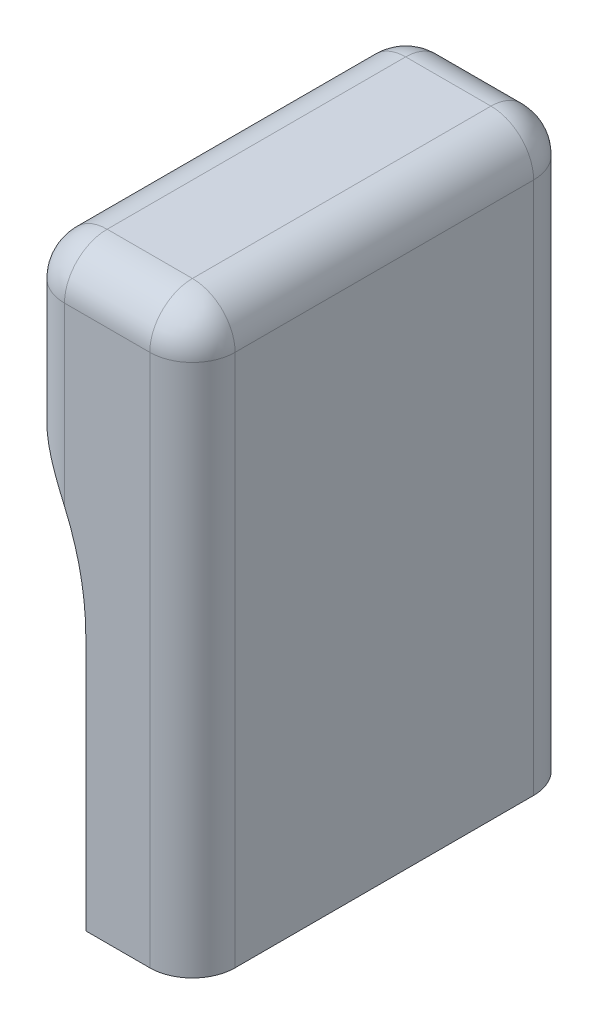
ISO-10303-21;
HEADER;
FILE_DESCRIPTION(('STEP AP214'),'2;1');
FILE_NAME('part.step','',(''),(''),'','','');
FILE_SCHEMA(('AUTOMOTIVE_DESIGN { 1 0 10303 214 1 1 1 1 }'));
ENDSEC;
DATA;
#1=APPLICATION_CONTEXT('core data for automotive mechanical design processes');
#2=APPLICATION_PROTOCOL_DEFINITION('international standard','automotive_design',2000,#1);
#3=PRODUCT_CONTEXT('',#1,'mechanical');
#4=PRODUCT('Part','Part','',(#3));
#5=PRODUCT_RELATED_PRODUCT_CATEGORY('part','',(#4));
#6=PRODUCT_DEFINITION_FORMATION('','',#4);
#7=PRODUCT_DEFINITION_CONTEXT('part definition',#1,'design');
#8=PRODUCT_DEFINITION('design','',#6,#7);
#9=PRODUCT_DEFINITION_SHAPE('','',#8);
#10=(LENGTH_UNIT() NAMED_UNIT(*) SI_UNIT(.MILLI.,.METRE.));
#11=(NAMED_UNIT(*) PLANE_ANGLE_UNIT() SI_UNIT($,.RADIAN.));
#12=(NAMED_UNIT(*) SI_UNIT($,.STERADIAN.) SOLID_ANGLE_UNIT());
#13=UNCERTAINTY_MEASURE_WITH_UNIT(LENGTH_MEASURE(1.E-05),#10,'distance_accuracy_value','');
#14=(GEOMETRIC_REPRESENTATION_CONTEXT(3) GLOBAL_UNCERTAINTY_ASSIGNED_CONTEXT((#13)) GLOBAL_UNIT_ASSIGNED_CONTEXT((#10,
#11,#12)) REPRESENTATION_CONTEXT('',''));
#15=CARTESIAN_POINT('',(0.,0.,0.));
#16=DIRECTION('',(0.,0.,1.));
#17=DIRECTION('',(1.,0.,0.));
#18=AXIS2_PLACEMENT_3D('',#15,#16,#17);
#19=CARTESIAN_POINT('',(-4.,27.,9.));
#20=DIRECTION('',(1.,0.,0.));
#21=DIRECTION('',(0.,0.,-1.));
#22=AXIS2_PLACEMENT_3D('',#19,#20,#21);
#23=PLANE('',#22);
#24=DIRECTION('',(0.,0.,1.));
#25=VECTOR('',#24,1.);
#26=CARTESIAN_POINT('',(-4.,25.,9.));
#27=LINE('',#26,#25);
#28=CARTESIAN_POINT('',(-4.,25.,7.));
#29=VERTEX_POINT('',#28);
#30=CARTESIAN_POINT('',(-4.,25.,-7.));
#31=VERTEX_POINT('',#30);
#32=EDGE_CURVE('E214',#29,#31,#27,.F.);
#33=ORIENTED_EDGE('',*,*,#32,.T.);
#34=DIRECTION('',(0.,-1.,0.));
#35=VECTOR('',#34,1.);
#36=CARTESIAN_POINT('',(-4.,27.,-7.));
#37=LINE('',#36,#35);
#38=CARTESIAN_POINT('',(-4.,20.6063865284869,-7.));
#39=VERTEX_POINT('',#38);
#40=EDGE_CURVE('E270',#31,#39,#37,.T.);
#41=ORIENTED_EDGE('',*,*,#40,.T.);
#42=DIRECTION('',(0.,0.,1.));
#43=VECTOR('',#42,1.);
#44=CARTESIAN_POINT('',(-4.,20.6063865284869,9.));
#45=LINE('',#44,#43);
#46=CARTESIAN_POINT('',(-4.,20.6063865284869,7.));
#47=VERTEX_POINT('',#46);
#48=EDGE_CURVE('E264',#39,#47,#45,.T.);
#49=ORIENTED_EDGE('',*,*,#48,.T.);
#50=DIRECTION('',(0.,-1.,0.));
#51=VECTOR('',#50,1.);
#52=CARTESIAN_POINT('',(-4.,27.,7.));
#53=LINE('',#52,#51);
#54=EDGE_CURVE('E267',#47,#29,#53,.F.);
#55=ORIENTED_EDGE('',*,*,#54,.T.);
#56=EDGE_LOOP('',(#33,#41,#49,#55));
#57=FACE_BOUND('',#56,.T.);
#58=ADVANCED_FACE('F47',(#57),#23,.F.);
#59=CARTESIAN_POINT('',(4.,27.,9.));
#60=DIRECTION('',(-1.,0.,0.));
#61=DIRECTION('',(0.,0.,1.));
#62=AXIS2_PLACEMENT_3D('',#59,#60,#61);
#63=PLANE('',#62);
#64=DIRECTION('',(0.,0.,-1.));
#65=VECTOR('',#64,1.);
#66=CARTESIAN_POINT('',(4.,0.,9.));
#67=LINE('',#66,#65);
#68=CARTESIAN_POINT('',(4.,0.,7.));
#69=VERTEX_POINT('',#68);
#70=CARTESIAN_POINT('',(4.,0.,-7.));
#71=VERTEX_POINT('',#70);
#72=EDGE_CURVE('E179',#69,#71,#67,.T.);
#73=ORIENTED_EDGE('',*,*,#72,.T.);
#74=DIRECTION('',(0.,-1.,0.));
#75=VECTOR('',#74,1.);
#76=CARTESIAN_POINT('',(4.,27.,-7.));
#77=LINE('',#76,#75);
#78=CARTESIAN_POINT('',(4.,25.,-7.));
#79=VERTEX_POINT('',#78);
#80=EDGE_CURVE('E230',#71,#79,#77,.F.);
#81=ORIENTED_EDGE('',*,*,#80,.T.);
#82=DIRECTION('',(0.,0.,-1.));
#83=VECTOR('',#82,1.);
#84=CARTESIAN_POINT('',(4.,25.,9.));
#85=LINE('',#84,#83);
#86=CARTESIAN_POINT('',(4.,25.,7.));
#87=VERTEX_POINT('',#86);
#88=EDGE_CURVE('E227',#79,#87,#85,.F.);
#89=ORIENTED_EDGE('',*,*,#88,.T.);
#90=DIRECTION('',(0.,-1.,0.));
#91=VECTOR('',#90,1.);
#92=CARTESIAN_POINT('',(4.,27.,7.));
#93=LINE('',#92,#91);
#94=EDGE_CURVE('E185',#87,#69,#93,.T.);
#95=ORIENTED_EDGE('',*,*,#94,.T.);
#96=EDGE_LOOP('',(#73,#81,#89,#95));
#97=FACE_BOUND('',#96,.T.);
#98=ADVANCED_FACE('F309',(#97),#63,.F.);
#99=CARTESIAN_POINT('',(-4.,27.,-9.));
#100=DIRECTION('',(0.,0.,1.));
#101=DIRECTION('',(1.,0.,0.));
#102=AXIS2_PLACEMENT_3D('',#99,#100,#101);
#103=PLANE('',#102);
#104=CARTESIAN_POINT('',(-12.96,11.96,-9.));
#105=DIRECTION('',(0.,0.,1.));
#106=DIRECTION('',(1.,0.,0.));
#107=AXIS2_PLACEMENT_3D('',#104,#105,#106);
#108=CIRCLE('',#107,11.96);
#109=CARTESIAN_POINT('',(-0.999999999999999,11.96,-9.));
#110=VERTEX_POINT('',#109);
#111=CARTESIAN_POINT('',(-2.,16.7474836814343,-9.));
#112=VERTEX_POINT('',#111);
#113=EDGE_CURVE('E384',#110,#112,#108,.T.);
#114=ORIENTED_EDGE('',*,*,#113,.T.);
#115=DIRECTION('',(0.,-1.,0.));
#116=VECTOR('',#115,1.);
#117=CARTESIAN_POINT('',(-2.,27.,-9.));
#118=LINE('',#117,#116);
#119=CARTESIAN_POINT('',(-2.,25.,-9.));
#120=VERTEX_POINT('',#119);
#121=EDGE_CURVE('E57',#112,#120,#118,.F.);
#122=ORIENTED_EDGE('',*,*,#121,.T.);
#123=DIRECTION('',(-1.,0.,0.));
#124=VECTOR('',#123,1.);
#125=CARTESIAN_POINT('',(-4.,25.,-9.));
#126=LINE('',#125,#124);
#127=CARTESIAN_POINT('',(2.,25.,-9.));
#128=VERTEX_POINT('',#127);
#129=EDGE_CURVE('E221',#120,#128,#126,.F.);
#130=ORIENTED_EDGE('',*,*,#129,.T.);
#131=DIRECTION('',(0.,-1.,0.));
#132=VECTOR('',#131,1.);
#133=CARTESIAN_POINT('',(2.,27.,-9.));
#134=LINE('',#133,#132);
#135=CARTESIAN_POINT('',(2.,0.,-9.));
#136=VERTEX_POINT('',#135);
#137=EDGE_CURVE('E218',#128,#136,#134,.T.);
#138=ORIENTED_EDGE('',*,*,#137,.T.);
#139=DIRECTION('',(-1.,0.,0.));
#140=VECTOR('',#139,1.);
#141=CARTESIAN_POINT('',(-4.,0.,-9.));
#142=LINE('',#141,#140);
#143=CARTESIAN_POINT('',(-0.999999999999999,0.,-9.));
#144=VERTEX_POINT('',#143);
#145=EDGE_CURVE('E173',#136,#144,#142,.T.);
#146=ORIENTED_EDGE('',*,*,#145,.T.);
#147=DIRECTION('',(0.,1.,0.));
#148=VECTOR('',#147,1.);
#149=CARTESIAN_POINT('',(-0.999999999999999,27.,-9.));
#150=LINE('',#149,#148);
#151=EDGE_CURVE('E151',#144,#110,#150,.T.);
#152=ORIENTED_EDGE('',*,*,#151,.T.);
#153=EDGE_LOOP('',(#114,#122,#130,#138,#146,#152));
#154=FACE_BOUND('',#153,.T.);
#155=ADVANCED_FACE('F306',(#154),#103,.F.);
#156=CARTESIAN_POINT('',(-4.,27.,9.));
#157=DIRECTION('',(0.,0.,-1.));
#158=DIRECTION('',(-1.,0.,0.));
#159=AXIS2_PLACEMENT_3D('',#156,#157,#158);
#160=PLANE('',#159);
#161=DIRECTION('',(1.,0.,0.));
#162=VECTOR('',#161,1.);
#163=CARTESIAN_POINT('',(-4.,25.,9.));
#164=LINE('',#163,#162);
#165=CARTESIAN_POINT('',(2.,25.,9.));
#166=VERTEX_POINT('',#165);
#167=CARTESIAN_POINT('',(-2.,25.,9.));
#168=VERTEX_POINT('',#167);
#169=EDGE_CURVE('E208',#166,#168,#164,.F.);
#170=ORIENTED_EDGE('',*,*,#169,.T.);
#171=DIRECTION('',(0.,-1.,0.));
#172=VECTOR('',#171,1.);
#173=CARTESIAN_POINT('',(-2.,27.,9.));
#174=LINE('',#173,#172);
#175=CARTESIAN_POINT('',(-2.,16.7474836814343,9.));
#176=VERTEX_POINT('',#175);
#177=EDGE_CURVE('E11',#168,#176,#174,.T.);
#178=ORIENTED_EDGE('',*,*,#177,.T.);
#179=CARTESIAN_POINT('',(-12.96,11.96,9.));
#180=DIRECTION('',(0.,0.,-1.));
#181=DIRECTION('',(-1.,0.,0.));
#182=AXIS2_PLACEMENT_3D('',#179,#180,#181);
#183=CIRCLE('',#182,11.96);
#184=CARTESIAN_POINT('',(-0.999999999999999,11.96,9.));
#185=VERTEX_POINT('',#184);
#186=EDGE_CURVE('E164',#176,#185,#183,.T.);
#187=ORIENTED_EDGE('',*,*,#186,.T.);
#188=DIRECTION('',(0.,1.,0.));
#189=VECTOR('',#188,1.);
#190=CARTESIAN_POINT('',(-0.999999999999999,11.96,9.));
#191=LINE('',#190,#189);
#192=CARTESIAN_POINT('',(-0.999999999999999,0.,9.));
#193=VERTEX_POINT('',#192);
#194=EDGE_CURVE('E148',#193,#185,#191,.T.);
#195=ORIENTED_EDGE('',*,*,#194,.F.);
#196=DIRECTION('',(1.,0.,0.));
#197=VECTOR('',#196,1.);
#198=CARTESIAN_POINT('',(-4.,0.,9.));
#199=LINE('',#198,#197);
#200=CARTESIAN_POINT('',(2.,0.,9.));
#201=VERTEX_POINT('',#200);
#202=EDGE_CURVE('E162',#193,#201,#199,.T.);
#203=ORIENTED_EDGE('',*,*,#202,.T.);
#204=DIRECTION('',(0.,-1.,0.));
#205=VECTOR('',#204,1.);
#206=CARTESIAN_POINT('',(2.,27.,9.));
#207=LINE('',#206,#205);
#208=EDGE_CURVE('E190',#201,#166,#207,.F.);
#209=ORIENTED_EDGE('',*,*,#208,.T.);
#210=EDGE_LOOP('',(#170,#178,#187,#195,#203,#209));
#211=FACE_BOUND('',#210,.T.);
#212=ADVANCED_FACE('F160',(#211),#160,.F.);
#213=CARTESIAN_POINT('',(0.,27.,0.));
#214=DIRECTION('',(0.,-1.,0.));
#215=DIRECTION('',(0.,0.,-1.));
#216=AXIS2_PLACEMENT_3D('',#213,#214,#215);
#217=PLANE('',#216);
#218=DIRECTION('',(0.,0.,1.));
#219=VECTOR('',#218,1.);
#220=CARTESIAN_POINT('',(-2.,27.,0.));
#221=LINE('',#220,#219);
#222=CARTESIAN_POINT('',(-2.,27.,-7.));
#223=VERTEX_POINT('',#222);
#224=CARTESIAN_POINT('',(-2.,27.,7.));
#225=VERTEX_POINT('',#224);
#226=EDGE_CURVE('E200',#223,#225,#221,.T.);
#227=ORIENTED_EDGE('',*,*,#226,.T.);
#228=DIRECTION('',(1.,0.,0.));
#229=VECTOR('',#228,1.);
#230=CARTESIAN_POINT('',(0.,27.,7.));
#231=LINE('',#230,#229);
#232=CARTESIAN_POINT('',(2.,27.,7.));
#233=VERTEX_POINT('',#232);
#234=EDGE_CURVE('E204',#225,#233,#231,.T.);
#235=ORIENTED_EDGE('',*,*,#234,.T.);
#236=DIRECTION('',(0.,0.,-1.));
#237=VECTOR('',#236,1.);
#238=CARTESIAN_POINT('',(2.,27.,0.));
#239=LINE('',#238,#237);
#240=CARTESIAN_POINT('',(2.,27.,-7.));
#241=VERTEX_POINT('',#240);
#242=EDGE_CURVE('E193',#233,#241,#239,.T.);
#243=ORIENTED_EDGE('',*,*,#242,.T.);
#244=DIRECTION('',(-1.,0.,0.));
#245=VECTOR('',#244,1.);
#246=CARTESIAN_POINT('',(0.,27.,-7.));
#247=LINE('',#246,#245);
#248=EDGE_CURVE('E196',#241,#223,#247,.T.);
#249=ORIENTED_EDGE('',*,*,#248,.T.);
#250=EDGE_LOOP('',(#227,#235,#243,#249));
#251=FACE_BOUND('',#250,.T.);
#252=ADVANCED_FACE('F297',(#251),#217,.F.);
#253=CARTESIAN_POINT('',(0.,0.,0.));
#254=DIRECTION('',(0.,-1.,0.));
#255=DIRECTION('',(0.,0.,-1.));
#256=AXIS2_PLACEMENT_3D('',#253,#254,#255);
#257=PLANE('',#256);
#258=ORIENTED_EDGE('',*,*,#145,.F.);
#259=CARTESIAN_POINT('',(2.,0.,-7.));
#260=DIRECTION('',(0.,-1.,0.));
#261=DIRECTION('',(0.,0.,-1.));
#262=AXIS2_PLACEMENT_3D('',#259,#260,#261);
#263=CIRCLE('',#262,2.);
#264=EDGE_CURVE('E224',#136,#71,#263,.T.);
#265=ORIENTED_EDGE('',*,*,#264,.T.);
#266=ORIENTED_EDGE('',*,*,#72,.F.);
#267=CARTESIAN_POINT('',(2.,0.,7.));
#268=DIRECTION('',(0.,-1.,0.));
#269=DIRECTION('',(0.,0.,-1.));
#270=AXIS2_PLACEMENT_3D('',#267,#268,#269);
#271=CIRCLE('',#270,2.);
#272=EDGE_CURVE('E171',#69,#201,#271,.T.);
#273=ORIENTED_EDGE('',*,*,#272,.T.);
#274=ORIENTED_EDGE('',*,*,#202,.F.);
#275=DIRECTION('',(0.,0.,1.));
#276=VECTOR('',#275,1.);
#277=CARTESIAN_POINT('',(-0.999999999999999,0.,-21.));
#278=LINE('',#277,#276);
#279=EDGE_CURVE('E145',#144,#193,#278,.T.);
#280=ORIENTED_EDGE('',*,*,#279,.F.);
#281=EDGE_LOOP('',(#258,#265,#266,#273,#274,#280));
#282=FACE_BOUND('',#281,.T.);
#283=ADVANCED_FACE('F168',(#282),#257,.T.);
#284=CARTESIAN_POINT('',(-12.96,11.96,-21.));
#285=DIRECTION('',(0.,0.,1.));
#286=DIRECTION('',(1.,0.,0.));
#287=AXIS2_PLACEMENT_3D('',#284,#285,#286);
#288=CYLINDRICAL_SURFACE('',#287,11.96);
#289=DIRECTION('',(0.,0.,1.));
#290=VECTOR('',#289,1.);
#291=CARTESIAN_POINT('',(-3.5702005730659,19.3676492034888,-21.));
#292=LINE('',#291,#290);
#293=CARTESIAN_POINT('',(-3.5702005730659,19.3676492034888,8.23873732499815));
#294=VERTEX_POINT('',#293);
#295=CARTESIAN_POINT('',(-3.5702005730659,19.3676492034888,-8.23873732499816));
#296=VERTEX_POINT('',#295);
#297=EDGE_CURVE('E65',#294,#296,#292,.F.);
#298=ORIENTED_EDGE('',*,*,#297,.T.);
#299=CARTESIAN_POINT('',(-3.5702005730659,19.3676492034888,-8.23873732499816));
#300=CARTESIAN_POINT('',(-3.52828066420022,19.3145341719683,-8.29183017886756));
#301=CARTESIAN_POINT('',(-3.48507498293404,19.2588201211261,-8.34110351385973));
#302=CARTESIAN_POINT('',(-3.39714119030171,19.1432096924865,-8.43249159422428));
#303=CARTESIAN_POINT('',(-3.3524175215427,19.0833250567258,-8.47462537560229));
#304=CARTESIAN_POINT('',(-3.26281902929601,18.9608566321523,-8.55201276856125));
#305=CARTESIAN_POINT('',(-3.21795296898045,18.8983155610036,-8.58734527195316));
#306=CARTESIAN_POINT('',(-3.12810376989606,18.770398750395,-8.65241054901131));
#307=CARTESIAN_POINT('',(-3.08312056410111,18.7050206516476,-8.68213854774009));
#308=CARTESIAN_POINT('',(-2.96801836905734,18.5340194648928,-8.75206120576248));
#309=CARTESIAN_POINT('',(-2.89818346601142,18.4266934078693,-8.78856642508489));
#310=CARTESIAN_POINT('',(-2.76075532289893,18.2076999566467,-8.85120308587612));
#311=CARTESIAN_POINT('',(-2.69316301526232,18.0960307975642,-8.87733026067855));
#312=CARTESIAN_POINT('',(-2.56054661366029,17.8685050247883,-8.92111841999538));
#313=CARTESIAN_POINT('',(-2.4955439124028,17.7526244937954,-8.93871860175508));
#314=CARTESIAN_POINT('',(-2.36913339276785,17.5181369879016,-8.96670495520389));
#315=CARTESIAN_POINT('',(-2.30772452234356,17.3995308251962,-8.97709324784991));
#316=CARTESIAN_POINT('',(-2.20459652412166,17.1918768421194,-8.98999398498242));
#317=CARTESIAN_POINT('',(-2.16198175093042,17.1033502775682,-8.99386578693393));
#318=CARTESIAN_POINT('',(-2.07922173112489,16.9258624480154,-8.99885522583756));
#319=CARTESIAN_POINT('',(-2.03906065514633,16.8369091421358,-8.99999286820821));
#320=CARTESIAN_POINT('',(-2.,16.7474836814343,-9.));
#321=B_SPLINE_CURVE_WITH_KNOTS('',3,(#299,#300,#301,#302,#303,#304,#305,#306,#307,#308,#309,
#310,#311,#312,#313,#314,#315,#316,#317,#318,#319,#320),.UNSPECIFIED.,.F.,.F.,(4,2,2,2,2,2,2,2,
2,2,4),(0.,0.257708359125911,0.514718399796056,0.768539040685107,1.02257496448198,
1.4213767586671,1.82034234068448,2.22211238916983,2.62376423029726,2.91867643659555,
3.21142415752358),.UNSPECIFIED.);
#322=EDGE_CURVE('E282',#296,#112,#321,.T.);
#323=ORIENTED_EDGE('',*,*,#322,.T.);
#324=ORIENTED_EDGE('',*,*,#113,.F.);
#325=DIRECTION('',(0.,0.,1.));
#326=VECTOR('',#325,1.);
#327=CARTESIAN_POINT('',(-0.999999999999999,11.96,-21.));
#328=LINE('',#327,#326);
#329=EDGE_CURVE('E177',#110,#185,#328,.T.);
#330=ORIENTED_EDGE('',*,*,#329,.T.);
#331=ORIENTED_EDGE('',*,*,#186,.F.);
#332=CARTESIAN_POINT('',(-2.,16.7474836814343,9.));
#333=CARTESIAN_POINT('',(-2.03446994215914,16.8263959550185,8.99999671074215));
#334=CARTESIAN_POINT('',(-2.06979104461575,16.9049323477453,8.99910923825189));
#335=CARTESIAN_POINT('',(-2.142111502888,17.0612064625607,8.99527398225222));
#336=CARTESIAN_POINT('',(-2.17911138278942,17.1389439258178,8.99232555115042));
#337=CARTESIAN_POINT('',(-2.29286632947785,17.3714400346089,8.97991788540076));
#338=CARTESIAN_POINT('',(-2.3720966257601,17.5248412083448,8.96689149446143));
#339=CARTESIAN_POINT('',(-2.53311166011626,17.8207868763352,8.92933867385934));
#340=CARTESIAN_POINT('',(-2.6146620047779,17.963519276631,8.90530073394223));
#341=CARTESIAN_POINT('',(-2.78205269246915,18.2431060002461,8.84292391828355));
#342=CARTESIAN_POINT('',(-2.86788616404143,18.379969122814,8.80460734912279));
#343=CARTESIAN_POINT('',(-3.0059807714662,18.5908240567816,8.72955691571832));
#344=CARTESIAN_POINT('',(-3.05746066012566,18.6674289230892,8.69870991996067));
#345=CARTESIAN_POINT('',(-3.1605903707054,18.8172165513468,8.62999097086036));
#346=CARTESIAN_POINT('',(-3.21223998488274,18.890402493272,8.59212571498558));
#347=CARTESIAN_POINT('',(-3.31613646748375,19.0342874316548,8.50744116284946));
#348=CARTESIAN_POINT('',(-3.3683688487345,19.1048875707152,8.46043236106519));
#349=CARTESIAN_POINT('',(-3.44533831184622,19.2066985365846,8.38286993440399));
#350=CARTESIAN_POINT('',(-3.47081155703522,19.2400127745425,8.35578329055448));
#351=CARTESIAN_POINT('',(-3.52107462001007,19.3050652462124,8.29913989126033));
#352=CARTESIAN_POINT('',(-3.54586397669083,19.3368024276293,8.26958152091665));
#353=CARTESIAN_POINT('',(-3.5702005730659,19.3676492034888,8.23873732499813));
#354=B_SPLINE_CURVE_WITH_KNOTS('',3,(#332,#333,#334,#335,#336,#337,#338,#339,#340,#341,#342,
#343,#344,#345,#346,#347,#348,#349,#350,#351,#352,#353),.UNSPECIFIED.,.F.,.F.,(4,2,2,2,2,2,2,2,
2,2,4),(0.,0.258316087671606,0.516713379678056,1.03560297575639,1.53342086148382,
2.03046427675004,2.32214766365074,2.61355411938948,2.9118084912318,3.06149989373755,
3.21128987270072),.UNSPECIFIED.);
#355=EDGE_CURVE('E70',#176,#294,#354,.T.);
#356=ORIENTED_EDGE('',*,*,#355,.T.);
#357=EDGE_LOOP('',(#298,#323,#324,#330,#331,#356));
#358=FACE_BOUND('',#357,.T.);
#359=ADVANCED_FACE('F292',(#358),#288,.F.);
#360=CARTESIAN_POINT('',(-0.999999999999999,11.96,-21.));
#361=DIRECTION('',(1.,0.,0.));
#362=DIRECTION('',(0.,0.,-1.));
#363=AXIS2_PLACEMENT_3D('',#360,#361,#362);
#364=PLANE('',#363);
#365=ORIENTED_EDGE('',*,*,#279,.T.);
#366=ORIENTED_EDGE('',*,*,#194,.T.);
#367=ORIENTED_EDGE('',*,*,#329,.F.);
#368=ORIENTED_EDGE('',*,*,#151,.F.);
#369=EDGE_LOOP('',(#365,#366,#367,#368));
#370=FACE_BOUND('',#369,.T.);
#371=ADVANCED_FACE('F147',(#370),#364,.F.);
#372=CARTESIAN_POINT('',(2.,27.,7.));
#373=DIRECTION('',(0.,-1.,0.));
#374=DIRECTION('',(0.,0.,-1.));
#375=AXIS2_PLACEMENT_3D('',#372,#373,#374);
#376=CYLINDRICAL_SURFACE('',#375,2.);
#377=ORIENTED_EDGE('',*,*,#94,.F.);
#378=CARTESIAN_POINT('',(2.,25.,7.));
#379=DIRECTION('',(0.,-1.,0.));
#380=DIRECTION('',(0.,0.,-1.));
#381=AXIS2_PLACEMENT_3D('',#378,#379,#380);
#382=CIRCLE('',#381,2.);
#383=EDGE_CURVE('E211',#87,#166,#382,.T.);
#384=ORIENTED_EDGE('',*,*,#383,.T.);
#385=ORIENTED_EDGE('',*,*,#208,.F.);
#386=ORIENTED_EDGE('',*,*,#272,.F.);
#387=EDGE_LOOP('',(#377,#384,#385,#386));
#388=FACE_BOUND('',#387,.T.);
#389=ADVANCED_FACE('F317',(#388),#376,.T.);
#390=CARTESIAN_POINT('',(2.,27.,-7.));
#391=DIRECTION('',(0.,-1.,0.));
#392=DIRECTION('',(0.,0.,-1.));
#393=AXIS2_PLACEMENT_3D('',#390,#391,#392);
#394=CYLINDRICAL_SURFACE('',#393,2.);
#395=CARTESIAN_POINT('',(2.,25.,-7.));
#396=DIRECTION('',(0.,1.,0.));
#397=DIRECTION('',(0.,0.,1.));
#398=AXIS2_PLACEMENT_3D('',#395,#396,#397);
#399=CIRCLE('',#398,2.);
#400=EDGE_CURVE('E166',#79,#128,#399,.T.);
#401=ORIENTED_EDGE('',*,*,#400,.F.);
#402=ORIENTED_EDGE('',*,*,#80,.F.);
#403=ORIENTED_EDGE('',*,*,#264,.F.);
#404=ORIENTED_EDGE('',*,*,#137,.F.);
#405=EDGE_LOOP('',(#401,#402,#403,#404));
#406=FACE_BOUND('',#405,.T.);
#407=ADVANCED_FACE('F320',(#406),#394,.T.);
#408=CARTESIAN_POINT('',(2.,25.,-7.));
#409=DIRECTION('',(0.,0.,-1.));
#410=DIRECTION('',(-1.,0.,0.));
#411=AXIS2_PLACEMENT_3D('',#408,#409,#410);
#412=SPHERICAL_SURFACE('',#411,2.);
#413=CARTESIAN_POINT('',(2.,25.,-7.));
#414=DIRECTION('',(0.,0.,-1.));
#415=DIRECTION('',(-1.,0.,0.));
#416=AXIS2_PLACEMENT_3D('',#413,#414,#415);
#417=CIRCLE('',#416,2.);
#418=EDGE_CURVE('E241',#79,#241,#417,.F.);
#419=ORIENTED_EDGE('',*,*,#418,.F.);
#420=ORIENTED_EDGE('',*,*,#400,.T.);
#421=CARTESIAN_POINT('',(2.,25.,-7.));
#422=DIRECTION('',(1.,0.,0.));
#423=DIRECTION('',(0.,0.,-1.));
#424=AXIS2_PLACEMENT_3D('',#421,#422,#423);
#425=CIRCLE('',#424,2.);
#426=EDGE_CURVE('E245',#241,#128,#425,.F.);
#427=ORIENTED_EDGE('',*,*,#426,.F.);
#428=EDGE_LOOP('',(#419,#420,#427));
#429=FACE_BOUND('',#428,.T.);
#430=ADVANCED_FACE('F341',(#429),#412,.T.);
#431=CARTESIAN_POINT('',(0.,25.,-7.));
#432=DIRECTION('',(-1.,0.,0.));
#433=DIRECTION('',(0.,0.,1.));
#434=AXIS2_PLACEMENT_3D('',#431,#432,#433);
#435=CYLINDRICAL_SURFACE('',#434,2.);
#436=ORIENTED_EDGE('',*,*,#129,.F.);
#437=CARTESIAN_POINT('',(-2.,25.,-7.));
#438=DIRECTION('',(-1.,0.,0.));
#439=DIRECTION('',(0.,0.,1.));
#440=AXIS2_PLACEMENT_3D('',#437,#438,#439);
#441=CIRCLE('',#440,2.);
#442=EDGE_CURVE('E258',#120,#223,#441,.F.);
#443=ORIENTED_EDGE('',*,*,#442,.T.);
#444=ORIENTED_EDGE('',*,*,#248,.F.);
#445=ORIENTED_EDGE('',*,*,#426,.T.);
#446=EDGE_LOOP('',(#436,#443,#444,#445));
#447=FACE_BOUND('',#446,.T.);
#448=ADVANCED_FACE('F337',(#447),#435,.T.);
#449=CARTESIAN_POINT('',(2.,25.,0.));
#450=DIRECTION('',(0.,0.,-1.));
#451=DIRECTION('',(-1.,0.,0.));
#452=AXIS2_PLACEMENT_3D('',#449,#450,#451);
#453=CYLINDRICAL_SURFACE('',#452,2.);
#454=ORIENTED_EDGE('',*,*,#418,.T.);
#455=ORIENTED_EDGE('',*,*,#242,.F.);
#456=CARTESIAN_POINT('',(2.,25.,7.));
#457=DIRECTION('',(0.,0.,1.));
#458=DIRECTION('',(1.,0.,0.));
#459=AXIS2_PLACEMENT_3D('',#456,#457,#458);
#460=CIRCLE('',#459,2.);
#461=EDGE_CURVE('E237',#87,#233,#460,.T.);
#462=ORIENTED_EDGE('',*,*,#461,.F.);
#463=ORIENTED_EDGE('',*,*,#88,.F.);
#464=EDGE_LOOP('',(#454,#455,#462,#463));
#465=FACE_BOUND('',#464,.T.);
#466=ADVANCED_FACE('F333',(#465),#453,.T.);
#467=CARTESIAN_POINT('',(-2.,25.,0.));
#468=DIRECTION('',(0.,0.,1.));
#469=DIRECTION('',(1.,0.,0.));
#470=AXIS2_PLACEMENT_3D('',#467,#468,#469);
#471=CYLINDRICAL_SURFACE('',#470,2.);
#472=ORIENTED_EDGE('',*,*,#226,.F.);
#473=CARTESIAN_POINT('',(-2.,25.,-7.));
#474=DIRECTION('',(0.,0.,1.));
#475=DIRECTION('',(1.,0.,0.));
#476=AXIS2_PLACEMENT_3D('',#473,#474,#475);
#477=CIRCLE('',#476,2.);
#478=EDGE_CURVE('E254',#223,#31,#477,.T.);
#479=ORIENTED_EDGE('',*,*,#478,.T.);
#480=ORIENTED_EDGE('',*,*,#32,.F.);
#481=CARTESIAN_POINT('',(-2.,25.,7.));
#482=DIRECTION('',(0.,0.,1.));
#483=DIRECTION('',(1.,0.,0.));
#484=AXIS2_PLACEMENT_3D('',#481,#482,#483);
#485=CIRCLE('',#484,2.);
#486=EDGE_CURVE('E233',#29,#225,#485,.F.);
#487=ORIENTED_EDGE('',*,*,#486,.T.);
#488=EDGE_LOOP('',(#472,#479,#480,#487));
#489=FACE_BOUND('',#488,.T.);
#490=ADVANCED_FACE('F329',(#489),#471,.T.);
#491=CARTESIAN_POINT('',(2.,25.,7.));
#492=DIRECTION('',(0.,-1.,0.));
#493=DIRECTION('',(0.,0.,-1.));
#494=AXIS2_PLACEMENT_3D('',#491,#492,#493);
#495=SPHERICAL_SURFACE('',#494,2.);
#496=ORIENTED_EDGE('',*,*,#383,.F.);
#497=ORIENTED_EDGE('',*,*,#461,.T.);
#498=CARTESIAN_POINT('',(2.,25.,7.));
#499=DIRECTION('',(-1.,0.,0.));
#500=DIRECTION('',(0.,0.,1.));
#501=AXIS2_PLACEMENT_3D('',#498,#499,#500);
#502=CIRCLE('',#501,2.);
#503=EDGE_CURVE('E234',#166,#233,#502,.T.);
#504=ORIENTED_EDGE('',*,*,#503,.F.);
#505=EDGE_LOOP('',(#496,#497,#504));
#506=FACE_BOUND('',#505,.T.);
#507=ADVANCED_FACE('F325',(#506),#495,.T.);
#508=CARTESIAN_POINT('',(0.,25.,7.));
#509=DIRECTION('',(1.,0.,0.));
#510=DIRECTION('',(0.,0.,-1.));
#511=AXIS2_PLACEMENT_3D('',#508,#509,#510);
#512=CYLINDRICAL_SURFACE('',#511,2.);
#513=ORIENTED_EDGE('',*,*,#234,.F.);
#514=CARTESIAN_POINT('',(-2.,25.,7.));
#515=DIRECTION('',(1.,0.,0.));
#516=DIRECTION('',(0.,0.,-1.));
#517=AXIS2_PLACEMENT_3D('',#514,#515,#516);
#518=CIRCLE('',#517,2.);
#519=EDGE_CURVE('E261',#225,#168,#518,.T.);
#520=ORIENTED_EDGE('',*,*,#519,.T.);
#521=ORIENTED_EDGE('',*,*,#169,.F.);
#522=ORIENTED_EDGE('',*,*,#503,.T.);
#523=EDGE_LOOP('',(#513,#520,#521,#522));
#524=FACE_BOUND('',#523,.T.);
#525=ADVANCED_FACE('F322',(#524),#512,.T.);
#526=CARTESIAN_POINT('',(-2.,25.,7.));
#527=DIRECTION('',(0.,0.,1.));
#528=DIRECTION('',(1.,0.,0.));
#529=AXIS2_PLACEMENT_3D('',#526,#527,#528);
#530=SPHERICAL_SURFACE('',#529,2.);
#531=ORIENTED_EDGE('',*,*,#519,.F.);
#532=ORIENTED_EDGE('',*,*,#486,.F.);
#533=CARTESIAN_POINT('',(-2.,25.,7.));
#534=DIRECTION('',(0.,-1.,0.));
#535=DIRECTION('',(0.,0.,-1.));
#536=AXIS2_PLACEMENT_3D('',#533,#534,#535);
#537=CIRCLE('',#536,2.);
#538=EDGE_CURVE('E51',#168,#29,#537,.T.);
#539=ORIENTED_EDGE('',*,*,#538,.F.);
#540=EDGE_LOOP('',(#531,#532,#539));
#541=FACE_BOUND('',#540,.T.);
#542=ADVANCED_FACE('F49',(#541),#530,.T.);
#543=CARTESIAN_POINT('',(-2.,27.,7.));
#544=DIRECTION('',(0.,-1.,0.));
#545=DIRECTION('',(0.,0.,-1.));
#546=AXIS2_PLACEMENT_3D('',#543,#544,#545);
#547=CYLINDRICAL_SURFACE('',#546,2.);
#548=ORIENTED_EDGE('',*,*,#538,.T.);
#549=ORIENTED_EDGE('',*,*,#54,.F.);
#550=CARTESIAN_POINT('',(-2.,20.6063865284869,7.));
#551=DIRECTION('',(0.,0.707106781186547,0.707106781186547));
#552=DIRECTION('',(0.,-0.707106781186547,0.707106781186547));
#553=AXIS2_PLACEMENT_3D('',#550,#551,#552);
#554=ELLIPSE('',#553,2.82842712474619,2.);
#555=EDGE_CURVE('E365',#294,#47,#554,.F.);
#556=ORIENTED_EDGE('',*,*,#555,.F.);
#557=ORIENTED_EDGE('',*,*,#355,.F.);
#558=ORIENTED_EDGE('',*,*,#177,.F.);
#559=EDGE_LOOP('',(#548,#549,#556,#557,#558));
#560=FACE_BOUND('',#559,.T.);
#561=ADVANCED_FACE('F289',(#560),#547,.T.);
#562=CARTESIAN_POINT('',(-2.,20.6063865284869,-21.));
#563=DIRECTION('',(0.,0.,1.));
#564=DIRECTION('',(1.,0.,0.));
#565=AXIS2_PLACEMENT_3D('',#562,#563,#564);
#566=CYLINDRICAL_SURFACE('',#565,2.);
#567=ORIENTED_EDGE('',*,*,#555,.T.);
#568=ORIENTED_EDGE('',*,*,#48,.F.);
#569=CARTESIAN_POINT('',(-2.,20.6063865284869,-7.));
#570=DIRECTION('',(0.,-0.707106781186547,0.707106781186547));
#571=DIRECTION('',(0.,0.707106781186547,0.707106781186547));
#572=AXIS2_PLACEMENT_3D('',#569,#570,#571);
#573=ELLIPSE('',#572,2.82842712474619,2.);
#574=EDGE_CURVE('E369',#296,#39,#573,.F.);
#575=ORIENTED_EDGE('',*,*,#574,.F.);
#576=ORIENTED_EDGE('',*,*,#297,.F.);
#577=EDGE_LOOP('',(#567,#568,#575,#576));
#578=FACE_BOUND('',#577,.T.);
#579=ADVANCED_FACE('F355',(#578),#566,.T.);
#580=CARTESIAN_POINT('',(-2.,27.,-7.));
#581=DIRECTION('',(0.,-1.,0.));
#582=DIRECTION('',(0.,0.,-1.));
#583=AXIS2_PLACEMENT_3D('',#580,#581,#582);
#584=CYLINDRICAL_SURFACE('',#583,2.);
#585=ORIENTED_EDGE('',*,*,#574,.T.);
#586=ORIENTED_EDGE('',*,*,#40,.F.);
#587=CARTESIAN_POINT('',(-2.,25.,-7.));
#588=DIRECTION('',(0.,1.,0.));
#589=DIRECTION('',(0.,0.,1.));
#590=AXIS2_PLACEMENT_3D('',#587,#588,#589);
#591=CIRCLE('',#590,2.);
#592=EDGE_CURVE('E373',#120,#31,#591,.T.);
#593=ORIENTED_EDGE('',*,*,#592,.F.);
#594=ORIENTED_EDGE('',*,*,#121,.F.);
#595=ORIENTED_EDGE('',*,*,#322,.F.);
#596=EDGE_LOOP('',(#585,#586,#593,#594,#595));
#597=FACE_BOUND('',#596,.T.);
#598=ADVANCED_FACE('F351',(#597),#584,.T.);
#599=CARTESIAN_POINT('',(-2.,25.,-7.));
#600=DIRECTION('',(0.,0.,1.));
#601=DIRECTION('',(1.,0.,0.));
#602=AXIS2_PLACEMENT_3D('',#599,#600,#601);
#603=SPHERICAL_SURFACE('',#602,2.);
#604=ORIENTED_EDGE('',*,*,#478,.F.);
#605=ORIENTED_EDGE('',*,*,#442,.F.);
#606=ORIENTED_EDGE('',*,*,#592,.T.);
#607=EDGE_LOOP('',(#604,#605,#606));
#608=FACE_BOUND('',#607,.T.);
#609=ADVANCED_FACE('F349',(#608),#603,.T.);
#610=CLOSED_SHELL('',(#58,#98,#155,#212,#252,#283,#359,#371,#389,#407,#430,#448,#466,#490,#507,
#525,#542,#561,#579,#598,#609));
#611=MANIFOLD_SOLID_BREP('B2',#610);
#612=ADVANCED_BREP_SHAPE_REPRESENTATION('',(#18,#611),#14);
#613=SHAPE_DEFINITION_REPRESENTATION(#9,#612);
ENDSEC;
END-ISO-10303-21;
